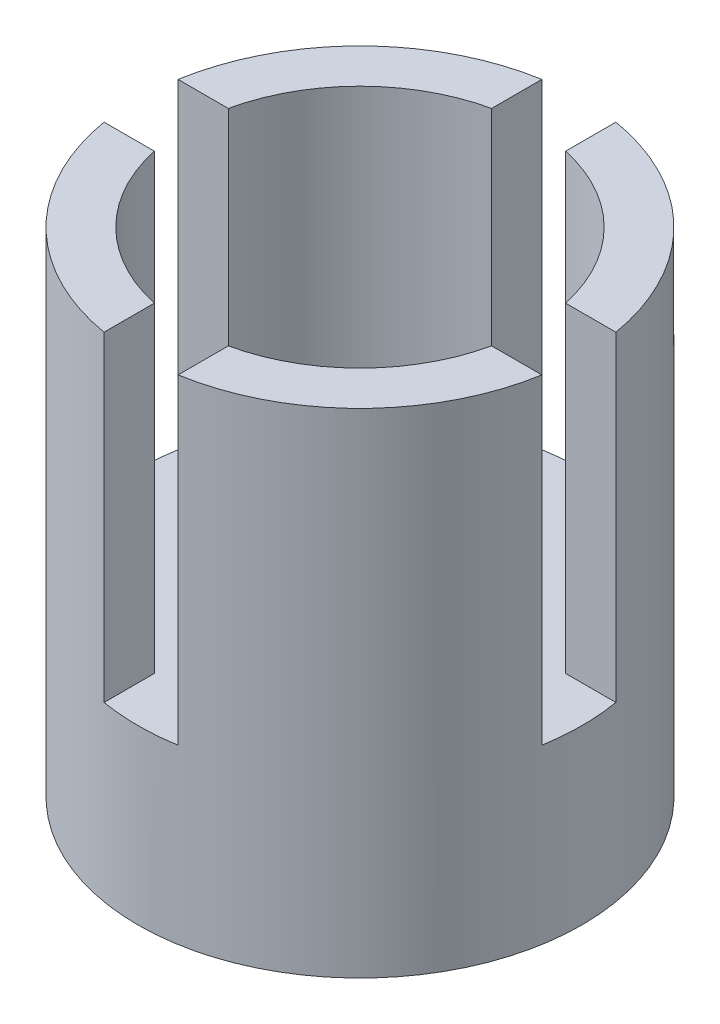
ISO-10303-21;
HEADER;
FILE_DESCRIPTION(('STEP AP214'),'2;1');
FILE_NAME('part.step','',(''),(''),'','','');
FILE_SCHEMA(('AUTOMOTIVE_DESIGN { 1 0 10303 214 1 1 1 1 }'));
ENDSEC;
DATA;
#1=APPLICATION_CONTEXT('core data for automotive mechanical design processes');
#2=APPLICATION_PROTOCOL_DEFINITION('international standard','automotive_design',2000,#1);
#3=PRODUCT_CONTEXT('',#1,'mechanical');
#4=PRODUCT('Part','Part','',(#3));
#5=PRODUCT_RELATED_PRODUCT_CATEGORY('part','',(#4));
#6=PRODUCT_DEFINITION_FORMATION('','',#4);
#7=PRODUCT_DEFINITION_CONTEXT('part definition',#1,'design');
#8=PRODUCT_DEFINITION('design','',#6,#7);
#9=PRODUCT_DEFINITION_SHAPE('','',#8);
#10=(LENGTH_UNIT() NAMED_UNIT(*) SI_UNIT(.MILLI.,.METRE.));
#11=(NAMED_UNIT(*) PLANE_ANGLE_UNIT() SI_UNIT($,.RADIAN.));
#12=(NAMED_UNIT(*) SI_UNIT($,.STERADIAN.) SOLID_ANGLE_UNIT());
#13=UNCERTAINTY_MEASURE_WITH_UNIT(LENGTH_MEASURE(1.E-05),#10,'distance_accuracy_value','');
#14=(GEOMETRIC_REPRESENTATION_CONTEXT(3) GLOBAL_UNCERTAINTY_ASSIGNED_CONTEXT((#13)) GLOBAL_UNIT_ASSIGNED_CONTEXT((#10,
#11,#12)) REPRESENTATION_CONTEXT('',''));
#15=CARTESIAN_POINT('',(0.,0.,0.));
#16=DIRECTION('',(0.,0.,1.));
#17=DIRECTION('',(1.,0.,0.));
#18=AXIS2_PLACEMENT_3D('',#15,#16,#17);
#19=CARTESIAN_POINT('',(0.,20.,0.));
#20=DIRECTION('',(0.,1.,0.));
#21=DIRECTION('',(0.,0.,1.));
#22=AXIS2_PLACEMENT_3D('',#19,#20,#21);
#23=PLANE('',#22);
#24=DIRECTION('',(-1.,0.,0.));
#25=VECTOR('',#24,1.);
#26=CARTESIAN_POINT('',(-9.14285714285731,20.,-1.5));
#27=LINE('',#26,#25);
#28=CARTESIAN_POINT('',(-6.83739716558867,20.,-1.5));
#29=VERTEX_POINT('',#28);
#30=CARTESIAN_POINT('',(-8.87411967464942,20.,-1.5));
#31=VERTEX_POINT('',#30);
#32=EDGE_CURVE('E268',#29,#31,#27,.T.);
#33=ORIENTED_EDGE('',*,*,#32,.F.);
#34=CARTESIAN_POINT('',(0.,20.,0.));
#35=DIRECTION('',(0.,1.,0.));
#36=DIRECTION('',(0.,0.,1.));
#37=AXIS2_PLACEMENT_3D('',#34,#35,#36);
#38=CIRCLE('',#37,7.);
#39=CARTESIAN_POINT('',(-1.5,20.,-6.83739716558867));
#40=VERTEX_POINT('',#39);
#41=EDGE_CURVE('E186',#40,#29,#38,.T.);
#42=ORIENTED_EDGE('',*,*,#41,.F.);
#43=DIRECTION('',(0.,0.,1.));
#44=VECTOR('',#43,1.);
#45=CARTESIAN_POINT('',(-1.5,20.,10.8462108796402));
#46=LINE('',#45,#44);
#47=CARTESIAN_POINT('',(-1.5,20.,-8.87411967464942));
#48=VERTEX_POINT('',#47);
#49=EDGE_CURVE('E292',#48,#40,#46,.T.);
#50=ORIENTED_EDGE('',*,*,#49,.F.);
#51=CARTESIAN_POINT('',(0.,20.,0.));
#52=DIRECTION('',(0.,1.,0.));
#53=DIRECTION('',(0.,0.,1.));
#54=AXIS2_PLACEMENT_3D('',#51,#52,#53);
#55=CIRCLE('',#54,9.);
#56=EDGE_CURVE('E239',#48,#31,#55,.T.);
#57=ORIENTED_EDGE('',*,*,#56,.T.);
#58=EDGE_LOOP('',(#33,#42,#50,#57));
#59=FACE_BOUND('',#58,.T.);
#60=ADVANCED_FACE('F36',(#59),#23,.T.);
#61=CARTESIAN_POINT('',(0.,7.,0.));
#62=DIRECTION('',(0.,1.,0.));
#63=DIRECTION('',(0.,0.,1.));
#64=AXIS2_PLACEMENT_3D('',#61,#62,#63);
#65=CYLINDRICAL_SURFACE('',#64,7.);
#66=ORIENTED_EDGE('',*,*,#41,.T.);
#67=DIRECTION('',(0.,1.,0.));
#68=VECTOR('',#67,1.);
#69=CARTESIAN_POINT('',(-6.83739716558867,7.,-1.5));
#70=LINE('',#69,#68);
#71=CARTESIAN_POINT('',(-6.83739716558867,7.,-1.5));
#72=VERTEX_POINT('',#71);
#73=EDGE_CURVE('E172',#29,#72,#70,.F.);
#74=ORIENTED_EDGE('',*,*,#73,.T.);
#75=CARTESIAN_POINT('',(0.,7.,0.));
#76=DIRECTION('',(0.,1.,0.));
#77=DIRECTION('',(0.,0.,1.));
#78=AXIS2_PLACEMENT_3D('',#75,#76,#77);
#79=CIRCLE('',#78,7.);
#80=CARTESIAN_POINT('',(-1.5,7.,-6.83739716558867));
#81=VERTEX_POINT('',#80);
#82=EDGE_CURVE('E184',#81,#72,#79,.T.);
#83=ORIENTED_EDGE('',*,*,#82,.F.);
#84=DIRECTION('',(0.,1.,0.));
#85=VECTOR('',#84,1.);
#86=CARTESIAN_POINT('',(-1.5,7.,-6.83739716558867));
#87=LINE('',#86,#85);
#88=EDGE_CURVE('E247',#81,#40,#87,.T.);
#89=ORIENTED_EDGE('',*,*,#88,.T.);
#90=EDGE_LOOP('',(#66,#74,#83,#89));
#91=FACE_BOUND('',#90,.T.);
#92=ADVANCED_FACE('F182',(#91),#65,.F.);
#93=CARTESIAN_POINT('',(8.87411967464942,20.,-1.5));
#94=VERTEX_POINT('',#93);
#95=CARTESIAN_POINT('',(6.83739716558867,20.,-1.5));
#96=VERTEX_POINT('',#95);
#97=EDGE_CURVE('E271',#94,#96,#27,.T.);
#98=ORIENTED_EDGE('',*,*,#97,.F.);
#99=CARTESIAN_POINT('',(1.5,20.,-8.87411967464942));
#100=VERTEX_POINT('',#99);
#101=EDGE_CURVE('E237',#94,#100,#55,.T.);
#102=ORIENTED_EDGE('',*,*,#101,.T.);
#103=DIRECTION('',(0.,0.,-1.));
#104=VECTOR('',#103,1.);
#105=CARTESIAN_POINT('',(1.5,20.,10.8462108796402));
#106=LINE('',#105,#104);
#107=CARTESIAN_POINT('',(1.5,20.,-6.83739716558867));
#108=VERTEX_POINT('',#107);
#109=EDGE_CURVE('E187',#108,#100,#106,.T.);
#110=ORIENTED_EDGE('',*,*,#109,.F.);
#111=EDGE_CURVE('E319',#96,#108,#38,.T.);
#112=ORIENTED_EDGE('',*,*,#111,.F.);
#113=EDGE_LOOP('',(#98,#102,#110,#112));
#114=FACE_BOUND('',#113,.T.);
#115=ADVANCED_FACE('F335',(#114),#23,.T.);
#116=CARTESIAN_POINT('',(6.83739716558867,7.,-1.5));
#117=VERTEX_POINT('',#116);
#118=CARTESIAN_POINT('',(1.5,7.,-6.83739716558867));
#119=VERTEX_POINT('',#118);
#120=EDGE_CURVE('E194',#117,#119,#79,.T.);
#121=ORIENTED_EDGE('',*,*,#120,.F.);
#122=DIRECTION('',(0.,1.,0.));
#123=VECTOR('',#122,1.);
#124=CARTESIAN_POINT('',(6.83739716558867,7.,-1.5));
#125=LINE('',#124,#123);
#126=EDGE_CURVE('E11',#117,#96,#125,.T.);
#127=ORIENTED_EDGE('',*,*,#126,.T.);
#128=ORIENTED_EDGE('',*,*,#111,.T.);
#129=DIRECTION('',(0.,1.,0.));
#130=VECTOR('',#129,1.);
#131=CARTESIAN_POINT('',(1.5,7.,-6.83739716558867));
#132=LINE('',#131,#130);
#133=EDGE_CURVE('E244',#108,#119,#132,.F.);
#134=ORIENTED_EDGE('',*,*,#133,.T.);
#135=EDGE_LOOP('',(#121,#127,#128,#134));
#136=FACE_BOUND('',#135,.T.);
#137=ADVANCED_FACE('F328',(#136),#65,.F.);
#138=DIRECTION('',(1.,0.,0.));
#139=VECTOR('',#138,1.);
#140=CARTESIAN_POINT('',(-9.14285714285731,20.,1.5));
#141=LINE('',#140,#139);
#142=CARTESIAN_POINT('',(-8.87411967464942,20.,1.5));
#143=VERTEX_POINT('',#142);
#144=CARTESIAN_POINT('',(-6.83739716558867,20.,1.5));
#145=VERTEX_POINT('',#144);
#146=EDGE_CURVE('E266',#143,#145,#141,.T.);
#147=ORIENTED_EDGE('',*,*,#146,.F.);
#148=CARTESIAN_POINT('',(-1.5,20.,8.87411967464942));
#149=VERTEX_POINT('',#148);
#150=EDGE_CURVE('E238',#143,#149,#55,.T.);
#151=ORIENTED_EDGE('',*,*,#150,.T.);
#152=CARTESIAN_POINT('',(-1.5,20.,6.83739716558867));
#153=VERTEX_POINT('',#152);
#154=EDGE_CURVE('E299',#153,#149,#46,.T.);
#155=ORIENTED_EDGE('',*,*,#154,.F.);
#156=EDGE_CURVE('E315',#145,#153,#38,.T.);
#157=ORIENTED_EDGE('',*,*,#156,.F.);
#158=EDGE_LOOP('',(#147,#151,#155,#157));
#159=FACE_BOUND('',#158,.T.);
#160=ADVANCED_FACE('F342',(#159),#23,.T.);
#161=CARTESIAN_POINT('',(-6.83739716558867,7.,1.5));
#162=VERTEX_POINT('',#161);
#163=CARTESIAN_POINT('',(-1.5,7.,6.83739716558867));
#164=VERTEX_POINT('',#163);
#165=EDGE_CURVE('E195',#162,#164,#79,.T.);
#166=ORIENTED_EDGE('',*,*,#165,.F.);
#167=DIRECTION('',(0.,1.,0.));
#168=VECTOR('',#167,1.);
#169=CARTESIAN_POINT('',(-6.83739716558867,7.,1.5));
#170=LINE('',#169,#168);
#171=EDGE_CURVE('E282',#162,#145,#170,.T.);
#172=ORIENTED_EDGE('',*,*,#171,.T.);
#173=ORIENTED_EDGE('',*,*,#156,.T.);
#174=DIRECTION('',(0.,1.,0.));
#175=VECTOR('',#174,1.);
#176=CARTESIAN_POINT('',(-1.5,7.,6.83739716558867));
#177=LINE('',#176,#175);
#178=EDGE_CURVE('E249',#153,#164,#177,.F.);
#179=ORIENTED_EDGE('',*,*,#178,.T.);
#180=EDGE_LOOP('',(#166,#172,#173,#179));
#181=FACE_BOUND('',#180,.T.);
#182=ADVANCED_FACE('F363',(#181),#65,.F.);
#183=CARTESIAN_POINT('',(0.,20.,0.));
#184=DIRECTION('',(0.,-1.,0.));
#185=DIRECTION('',(0.,0.,-1.));
#186=AXIS2_PLACEMENT_3D('',#183,#184,#185);
#187=CYLINDRICAL_SURFACE('',#186,9.);
#188=ORIENTED_EDGE('',*,*,#101,.F.);
#189=DIRECTION('',(0.,-1.,0.));
#190=VECTOR('',#189,1.);
#191=CARTESIAN_POINT('',(8.87411967464942,20.,-1.5));
#192=LINE('',#191,#190);
#193=CARTESIAN_POINT('',(8.87411967464942,7.,-1.5));
#194=VERTEX_POINT('',#193);
#195=EDGE_CURVE('E188',#94,#194,#192,.T.);
#196=ORIENTED_EDGE('',*,*,#195,.T.);
#197=CARTESIAN_POINT('',(0.,7.,0.));
#198=DIRECTION('',(0.,1.,0.));
#199=DIRECTION('',(0.,0.,1.));
#200=AXIS2_PLACEMENT_3D('',#197,#198,#199);
#201=CIRCLE('',#200,9.);
#202=CARTESIAN_POINT('',(8.87411967464942,7.,1.5));
#203=VERTEX_POINT('',#202);
#204=EDGE_CURVE('E276',#203,#194,#201,.T.);
#205=ORIENTED_EDGE('',*,*,#204,.F.);
#206=DIRECTION('',(0.,-1.,0.));
#207=VECTOR('',#206,1.);
#208=CARTESIAN_POINT('',(8.87411967464942,20.,1.5));
#209=LINE('',#208,#207);
#210=CARTESIAN_POINT('',(8.87411967464942,20.,1.5));
#211=VERTEX_POINT('',#210);
#212=EDGE_CURVE('E277',#203,#211,#209,.F.);
#213=ORIENTED_EDGE('',*,*,#212,.T.);
#214=CARTESIAN_POINT('',(1.5,20.,8.87411967464942));
#215=VERTEX_POINT('',#214);
#216=EDGE_CURVE('E233',#215,#211,#55,.T.);
#217=ORIENTED_EDGE('',*,*,#216,.F.);
#218=DIRECTION('',(0.,-1.,0.));
#219=VECTOR('',#218,1.);
#220=CARTESIAN_POINT('',(1.5,20.,8.87411967464942));
#221=LINE('',#220,#219);
#222=CARTESIAN_POINT('',(1.5,7.,8.87411967464942));
#223=VERTEX_POINT('',#222);
#224=EDGE_CURVE('E308',#215,#223,#221,.T.);
#225=ORIENTED_EDGE('',*,*,#224,.T.);
#226=CARTESIAN_POINT('',(0.,7.,0.));
#227=DIRECTION('',(0.,1.,0.));
#228=DIRECTION('',(0.,0.,1.));
#229=AXIS2_PLACEMENT_3D('',#226,#227,#228);
#230=CIRCLE('',#229,9.);
#231=CARTESIAN_POINT('',(-1.5,7.,8.87411967464942));
#232=VERTEX_POINT('',#231);
#233=EDGE_CURVE('E302',#232,#223,#230,.T.);
#234=ORIENTED_EDGE('',*,*,#233,.F.);
#235=DIRECTION('',(0.,-1.,0.));
#236=VECTOR('',#235,1.);
#237=CARTESIAN_POINT('',(-1.5,20.,8.87411967464942));
#238=LINE('',#237,#236);
#239=EDGE_CURVE('E311',#232,#149,#238,.F.);
#240=ORIENTED_EDGE('',*,*,#239,.T.);
#241=ORIENTED_EDGE('',*,*,#150,.F.);
#242=DIRECTION('',(0.,-1.,0.));
#243=VECTOR('',#242,1.);
#244=CARTESIAN_POINT('',(-8.87411967464942,20.,1.5));
#245=LINE('',#244,#243);
#246=CARTESIAN_POINT('',(-8.87411967464942,7.,1.5));
#247=VERTEX_POINT('',#246);
#248=EDGE_CURVE('E279',#143,#247,#245,.T.);
#249=ORIENTED_EDGE('',*,*,#248,.T.);
#250=CARTESIAN_POINT('',(-8.87411967464942,7.,-1.5));
#251=VERTEX_POINT('',#250);
#252=EDGE_CURVE('E274',#251,#247,#201,.T.);
#253=ORIENTED_EDGE('',*,*,#252,.F.);
#254=DIRECTION('',(0.,-1.,0.));
#255=VECTOR('',#254,1.);
#256=CARTESIAN_POINT('',(-8.87411967464942,20.,-1.5));
#257=LINE('',#256,#255);
#258=EDGE_CURVE('E175',#251,#31,#257,.F.);
#259=ORIENTED_EDGE('',*,*,#258,.T.);
#260=ORIENTED_EDGE('',*,*,#56,.F.);
#261=DIRECTION('',(0.,-1.,0.));
#262=VECTOR('',#261,1.);
#263=CARTESIAN_POINT('',(-1.5,20.,-8.87411967464942));
#264=LINE('',#263,#262);
#265=CARTESIAN_POINT('',(-1.5,7.,-8.87411967464942));
#266=VERTEX_POINT('',#265);
#267=EDGE_CURVE('E313',#48,#266,#264,.T.);
#268=ORIENTED_EDGE('',*,*,#267,.T.);
#269=CARTESIAN_POINT('',(1.5,7.,-8.87411967464942));
#270=VERTEX_POINT('',#269);
#271=EDGE_CURVE('E304',#270,#266,#230,.T.);
#272=ORIENTED_EDGE('',*,*,#271,.F.);
#273=DIRECTION('',(0.,-1.,0.));
#274=VECTOR('',#273,1.);
#275=CARTESIAN_POINT('',(1.5,20.,-8.87411967464942));
#276=LINE('',#275,#274);
#277=EDGE_CURVE('E305',#270,#100,#276,.F.);
#278=ORIENTED_EDGE('',*,*,#277,.T.);
#279=EDGE_LOOP('',(#188,#196,#205,#213,#217,#225,#234,#240,#241,#249,#253,#259,#260,#268,#272,#278));
#280=FACE_BOUND('',#279,.T.);
#281=CARTESIAN_POINT('',(0.,0.,0.));
#282=DIRECTION('',(0.,1.,0.));
#283=DIRECTION('',(0.,0.,1.));
#284=AXIS2_PLACEMENT_3D('',#281,#282,#283);
#285=CIRCLE('',#284,9.);
#286=CARTESIAN_POINT('',(0.,0.,9.));
#287=VERTEX_POINT('',#286);
#288=EDGE_CURVE('E226',#287,#287,#285,.T.);
#289=ORIENTED_EDGE('',*,*,#288,.T.);
#290=EDGE_LOOP('',(#289));
#291=FACE_BOUND('',#290,.T.);
#292=ADVANCED_FACE('F38',(#280,#291),#187,.T.);
#293=CARTESIAN_POINT('',(6.83739716558867,20.,1.5));
#294=VERTEX_POINT('',#293);
#295=EDGE_CURVE('E259',#294,#211,#141,.T.);
#296=ORIENTED_EDGE('',*,*,#295,.F.);
#297=CARTESIAN_POINT('',(1.5,20.,6.83739716558867));
#298=VERTEX_POINT('',#297);
#299=EDGE_CURVE('E198',#298,#294,#38,.T.);
#300=ORIENTED_EDGE('',*,*,#299,.F.);
#301=EDGE_CURVE('E298',#215,#298,#106,.T.);
#302=ORIENTED_EDGE('',*,*,#301,.F.);
#303=ORIENTED_EDGE('',*,*,#216,.T.);
#304=EDGE_LOOP('',(#296,#300,#302,#303));
#305=FACE_BOUND('',#304,.T.);
#306=ADVANCED_FACE('F263',(#305),#23,.T.);
#307=CARTESIAN_POINT('',(0.,0.,0.));
#308=DIRECTION('',(0.,1.,0.));
#309=DIRECTION('',(0.,0.,1.));
#310=AXIS2_PLACEMENT_3D('',#307,#308,#309);
#311=PLANE('',#310);
#312=DIRECTION('',(1.,0.,0.));
#313=VECTOR('',#312,1.);
#314=CARTESIAN_POINT('',(-2.12132034355964,0.,-1.75));
#315=LINE('',#314,#313);
#316=CARTESIAN_POINT('',(-2.12132034355964,0.,-1.75));
#317=VERTEX_POINT('',#316);
#318=CARTESIAN_POINT('',(2.12132034355964,0.,-1.75));
#319=VERTEX_POINT('',#318);
#320=EDGE_CURVE('E205',#317,#319,#315,.T.);
#321=ORIENTED_EDGE('',*,*,#320,.F.);
#322=CARTESIAN_POINT('',(0.,0.,0.));
#323=DIRECTION('',(0.,-1.,0.));
#324=DIRECTION('',(0.,0.,-1.));
#325=AXIS2_PLACEMENT_3D('',#322,#323,#324);
#326=CIRCLE('',#325,2.75);
#327=CARTESIAN_POINT('',(-2.12132034355964,0.,1.75));
#328=VERTEX_POINT('',#327);
#329=EDGE_CURVE('E202',#328,#317,#326,.T.);
#330=ORIENTED_EDGE('',*,*,#329,.F.);
#331=DIRECTION('',(-1.,0.,0.));
#332=VECTOR('',#331,1.);
#333=CARTESIAN_POINT('',(-2.12132034355964,0.,1.75));
#334=LINE('',#333,#332);
#335=CARTESIAN_POINT('',(2.12132034355964,0.,1.75));
#336=VERTEX_POINT('',#335);
#337=EDGE_CURVE('E220',#336,#328,#334,.T.);
#338=ORIENTED_EDGE('',*,*,#337,.F.);
#339=CARTESIAN_POINT('',(0.,0.,0.));
#340=DIRECTION('',(0.,-1.,0.));
#341=DIRECTION('',(0.,0.,-1.));
#342=AXIS2_PLACEMENT_3D('',#339,#340,#341);
#343=CIRCLE('',#342,2.75);
#344=EDGE_CURVE('E212',#319,#336,#343,.T.);
#345=ORIENTED_EDGE('',*,*,#344,.F.);
#346=EDGE_LOOP('',(#321,#330,#338,#345));
#347=FACE_BOUND('',#346,.T.);
#348=ORIENTED_EDGE('',*,*,#288,.F.);
#349=EDGE_LOOP('',(#348));
#350=FACE_BOUND('',#349,.T.);
#351=ADVANCED_FACE('F382',(#347,#350),#311,.F.);
#352=CARTESIAN_POINT('',(0.,7.,0.));
#353=DIRECTION('',(0.,-1.,0.));
#354=DIRECTION('',(0.,0.,-1.));
#355=AXIS2_PLACEMENT_3D('',#352,#353,#354);
#356=CYLINDRICAL_SURFACE('',#355,2.75);
#357=ORIENTED_EDGE('',*,*,#329,.T.);
#358=DIRECTION('',(0.,-1.,0.));
#359=VECTOR('',#358,1.);
#360=CARTESIAN_POINT('',(-2.12132034355964,7.,-1.75));
#361=LINE('',#360,#359);
#362=CARTESIAN_POINT('',(-2.12132034355964,7.,-1.75));
#363=VERTEX_POINT('',#362);
#364=EDGE_CURVE('E231',#363,#317,#361,.T.);
#365=ORIENTED_EDGE('',*,*,#364,.F.);
#366=CARTESIAN_POINT('',(0.,7.,0.));
#367=DIRECTION('',(0.,-1.,0.));
#368=DIRECTION('',(0.,0.,-1.));
#369=AXIS2_PLACEMENT_3D('',#366,#367,#368);
#370=CIRCLE('',#369,2.75);
#371=CARTESIAN_POINT('',(-2.12132034355964,7.,1.75));
#372=VERTEX_POINT('',#371);
#373=EDGE_CURVE('E223',#372,#363,#370,.T.);
#374=ORIENTED_EDGE('',*,*,#373,.F.);
#375=DIRECTION('',(0.,-1.,0.));
#376=VECTOR('',#375,1.);
#377=CARTESIAN_POINT('',(-2.12132034355964,7.,1.75));
#378=LINE('',#377,#376);
#379=EDGE_CURVE('E224',#372,#328,#378,.T.);
#380=ORIENTED_EDGE('',*,*,#379,.T.);
#381=EDGE_LOOP('',(#357,#365,#374,#380));
#382=FACE_BOUND('',#381,.T.);
#383=ADVANCED_FACE('F386',(#382),#356,.F.);
#384=CARTESIAN_POINT('',(-2.12132034355964,7.,1.75));
#385=DIRECTION('',(0.,0.,1.));
#386=DIRECTION('',(1.,0.,0.));
#387=AXIS2_PLACEMENT_3D('',#384,#385,#386);
#388=PLANE('',#387);
#389=ORIENTED_EDGE('',*,*,#337,.T.);
#390=ORIENTED_EDGE('',*,*,#379,.F.);
#391=DIRECTION('',(-1.,0.,0.));
#392=VECTOR('',#391,1.);
#393=CARTESIAN_POINT('',(-2.12132034355964,7.,1.75));
#394=LINE('',#393,#392);
#395=CARTESIAN_POINT('',(2.12132034355964,7.,1.75));
#396=VERTEX_POINT('',#395);
#397=EDGE_CURVE('E215',#396,#372,#394,.T.);
#398=ORIENTED_EDGE('',*,*,#397,.F.);
#399=DIRECTION('',(0.,-1.,0.));
#400=VECTOR('',#399,1.);
#401=CARTESIAN_POINT('',(2.12132034355964,7.,1.75));
#402=LINE('',#401,#400);
#403=EDGE_CURVE('E227',#396,#336,#402,.T.);
#404=ORIENTED_EDGE('',*,*,#403,.T.);
#405=EDGE_LOOP('',(#389,#390,#398,#404));
#406=FACE_BOUND('',#405,.T.);
#407=ADVANCED_FACE('F391',(#406),#388,.F.);
#408=CARTESIAN_POINT('',(0.,7.,0.));
#409=DIRECTION('',(0.,-1.,0.));
#410=DIRECTION('',(0.,0.,-1.));
#411=AXIS2_PLACEMENT_3D('',#408,#409,#410);
#412=CYLINDRICAL_SURFACE('',#411,2.75);
#413=ORIENTED_EDGE('',*,*,#344,.T.);
#414=ORIENTED_EDGE('',*,*,#403,.F.);
#415=CARTESIAN_POINT('',(0.,7.,0.));
#416=DIRECTION('',(0.,-1.,0.));
#417=DIRECTION('',(0.,0.,-1.));
#418=AXIS2_PLACEMENT_3D('',#415,#416,#417);
#419=CIRCLE('',#418,2.75);
#420=CARTESIAN_POINT('',(2.12132034355964,7.,-1.75));
#421=VERTEX_POINT('',#420);
#422=EDGE_CURVE('E406',#421,#396,#419,.T.);
#423=ORIENTED_EDGE('',*,*,#422,.F.);
#424=DIRECTION('',(0.,-1.,0.));
#425=VECTOR('',#424,1.);
#426=CARTESIAN_POINT('',(2.12132034355964,7.,-1.75));
#427=LINE('',#426,#425);
#428=EDGE_CURVE('E229',#421,#319,#427,.T.);
#429=ORIENTED_EDGE('',*,*,#428,.T.);
#430=EDGE_LOOP('',(#413,#414,#423,#429));
#431=FACE_BOUND('',#430,.T.);
#432=ADVANCED_FACE('F412',(#431),#412,.F.);
#433=CARTESIAN_POINT('',(-2.12132034355964,7.,-1.75));
#434=DIRECTION('',(0.,0.,-1.));
#435=DIRECTION('',(-1.,0.,0.));
#436=AXIS2_PLACEMENT_3D('',#433,#434,#435);
#437=PLANE('',#436);
#438=ORIENTED_EDGE('',*,*,#320,.T.);
#439=ORIENTED_EDGE('',*,*,#428,.F.);
#440=DIRECTION('',(1.,0.,0.));
#441=VECTOR('',#440,1.);
#442=CARTESIAN_POINT('',(-2.12132034355964,7.,-1.75));
#443=LINE('',#442,#441);
#444=EDGE_CURVE('E402',#363,#421,#443,.T.);
#445=ORIENTED_EDGE('',*,*,#444,.F.);
#446=ORIENTED_EDGE('',*,*,#364,.T.);
#447=EDGE_LOOP('',(#438,#439,#445,#446));
#448=FACE_BOUND('',#447,.T.);
#449=ADVANCED_FACE('F399',(#448),#437,.F.);
#450=CARTESIAN_POINT('',(0.,7.,0.));
#451=DIRECTION('',(0.,1.,0.));
#452=DIRECTION('',(0.,0.,1.));
#453=AXIS2_PLACEMENT_3D('',#450,#451,#452);
#454=PLANE('',#453);
#455=ORIENTED_EDGE('',*,*,#422,.T.);
#456=ORIENTED_EDGE('',*,*,#397,.T.);
#457=ORIENTED_EDGE('',*,*,#373,.T.);
#458=ORIENTED_EDGE('',*,*,#444,.T.);
#459=EDGE_LOOP('',(#455,#456,#457,#458));
#460=FACE_BOUND('',#459,.T.);
#461=DIRECTION('',(1.,0.,0.));
#462=VECTOR('',#461,1.);
#463=CARTESIAN_POINT('',(-9.14285714285731,7.,-1.5));
#464=LINE('',#463,#462);
#465=EDGE_CURVE('E58',#117,#194,#464,.T.);
#466=ORIENTED_EDGE('',*,*,#465,.F.);
#467=ORIENTED_EDGE('',*,*,#120,.T.);
#468=DIRECTION('',(0.,0.,-1.));
#469=VECTOR('',#468,1.);
#470=CARTESIAN_POINT('',(1.5,7.,10.8462108796402));
#471=LINE('',#470,#469);
#472=EDGE_CURVE('E288',#119,#270,#471,.T.);
#473=ORIENTED_EDGE('',*,*,#472,.T.);
#474=ORIENTED_EDGE('',*,*,#271,.T.);
#475=DIRECTION('',(0.,0.,1.));
#476=VECTOR('',#475,1.);
#477=CARTESIAN_POINT('',(-1.5,7.,10.8462108796402));
#478=LINE('',#477,#476);
#479=EDGE_CURVE('E192',#266,#81,#478,.T.);
#480=ORIENTED_EDGE('',*,*,#479,.T.);
#481=ORIENTED_EDGE('',*,*,#82,.T.);
#482=EDGE_CURVE('E51',#251,#72,#464,.T.);
#483=ORIENTED_EDGE('',*,*,#482,.F.);
#484=ORIENTED_EDGE('',*,*,#252,.T.);
#485=DIRECTION('',(-1.,0.,0.));
#486=VECTOR('',#485,1.);
#487=CARTESIAN_POINT('',(-9.14285714285731,7.,1.5));
#488=LINE('',#487,#486);
#489=EDGE_CURVE('E177',#162,#247,#488,.T.);
#490=ORIENTED_EDGE('',*,*,#489,.F.);
#491=ORIENTED_EDGE('',*,*,#165,.T.);
#492=EDGE_CURVE('E293',#164,#232,#478,.T.);
#493=ORIENTED_EDGE('',*,*,#492,.T.);
#494=ORIENTED_EDGE('',*,*,#233,.T.);
#495=CARTESIAN_POINT('',(1.5,7.,6.83739716558867));
#496=VERTEX_POINT('',#495);
#497=EDGE_CURVE('E291',#223,#496,#471,.T.);
#498=ORIENTED_EDGE('',*,*,#497,.T.);
#499=CARTESIAN_POINT('',(6.83739716558867,7.,1.5));
#500=VERTEX_POINT('',#499);
#501=EDGE_CURVE('E197',#496,#500,#79,.T.);
#502=ORIENTED_EDGE('',*,*,#501,.T.);
#503=EDGE_CURVE('E261',#203,#500,#488,.T.);
#504=ORIENTED_EDGE('',*,*,#503,.F.);
#505=ORIENTED_EDGE('',*,*,#204,.T.);
#506=EDGE_LOOP('',(#466,#467,#473,#474,#480,#481,#483,#484,#490,#491,#493,#494,#498,#502,#504,#505));
#507=FACE_BOUND('',#506,.T.);
#508=ADVANCED_FACE('F190',(#460,#507),#454,.T.);
#509=ORIENTED_EDGE('',*,*,#299,.T.);
#510=DIRECTION('',(0.,1.,0.));
#511=VECTOR('',#510,1.);
#512=CARTESIAN_POINT('',(6.83739716558867,7.,1.5));
#513=LINE('',#512,#511);
#514=EDGE_CURVE('E44',#294,#500,#513,.F.);
#515=ORIENTED_EDGE('',*,*,#514,.T.);
#516=ORIENTED_EDGE('',*,*,#501,.F.);
#517=DIRECTION('',(0.,1.,0.));
#518=VECTOR('',#517,1.);
#519=CARTESIAN_POINT('',(1.5,7.,6.83739716558867));
#520=LINE('',#519,#518);
#521=EDGE_CURVE('E236',#496,#298,#520,.T.);
#522=ORIENTED_EDGE('',*,*,#521,.T.);
#523=EDGE_LOOP('',(#509,#515,#516,#522));
#524=FACE_BOUND('',#523,.T.);
#525=ADVANCED_FACE('F254',(#524),#65,.F.);
#526=CARTESIAN_POINT('',(1.5,7.,10.8462108796402));
#527=DIRECTION('',(1.,0.,0.));
#528=DIRECTION('',(0.,0.,-1.));
#529=AXIS2_PLACEMENT_3D('',#526,#527,#528);
#530=PLANE('',#529);
#531=ORIENTED_EDGE('',*,*,#301,.T.);
#532=ORIENTED_EDGE('',*,*,#521,.F.);
#533=ORIENTED_EDGE('',*,*,#497,.F.);
#534=ORIENTED_EDGE('',*,*,#224,.F.);
#535=EDGE_LOOP('',(#531,#532,#533,#534));
#536=FACE_BOUND('',#535,.T.);
#537=ADVANCED_FACE('F351',(#536),#530,.F.);
#538=CARTESIAN_POINT('',(-1.5,7.,10.8462108796402));
#539=DIRECTION('',(-1.,0.,0.));
#540=DIRECTION('',(0.,0.,1.));
#541=AXIS2_PLACEMENT_3D('',#538,#539,#540);
#542=PLANE('',#541);
#543=ORIENTED_EDGE('',*,*,#492,.F.);
#544=ORIENTED_EDGE('',*,*,#178,.F.);
#545=ORIENTED_EDGE('',*,*,#154,.T.);
#546=ORIENTED_EDGE('',*,*,#239,.F.);
#547=EDGE_LOOP('',(#543,#544,#545,#546));
#548=FACE_BOUND('',#547,.T.);
#549=ADVANCED_FACE('F345',(#548),#542,.F.);
#550=ORIENTED_EDGE('',*,*,#49,.T.);
#551=ORIENTED_EDGE('',*,*,#88,.F.);
#552=ORIENTED_EDGE('',*,*,#479,.F.);
#553=ORIENTED_EDGE('',*,*,#267,.F.);
#554=EDGE_LOOP('',(#550,#551,#552,#553));
#555=FACE_BOUND('',#554,.T.);
#556=ADVANCED_FACE('F356',(#555),#542,.F.);
#557=ORIENTED_EDGE('',*,*,#472,.F.);
#558=ORIENTED_EDGE('',*,*,#133,.F.);
#559=ORIENTED_EDGE('',*,*,#109,.T.);
#560=ORIENTED_EDGE('',*,*,#277,.F.);
#561=EDGE_LOOP('',(#557,#558,#559,#560));
#562=FACE_BOUND('',#561,.T.);
#563=ADVANCED_FACE('F334',(#562),#530,.F.);
#564=CARTESIAN_POINT('',(-9.14285714285731,-14.5245990854793,1.5));
#565=DIRECTION('',(0.,0.,1.));
#566=DIRECTION('',(1.,0.,0.));
#567=AXIS2_PLACEMENT_3D('',#564,#565,#566);
#568=PLANE('',#567);
#569=ORIENTED_EDGE('',*,*,#503,.T.);
#570=ORIENTED_EDGE('',*,*,#514,.F.);
#571=ORIENTED_EDGE('',*,*,#295,.T.);
#572=ORIENTED_EDGE('',*,*,#212,.F.);
#573=EDGE_LOOP('',(#569,#570,#571,#572));
#574=FACE_BOUND('',#573,.T.);
#575=ADVANCED_FACE('F258',(#574),#568,.F.);
#576=CARTESIAN_POINT('',(-9.14285714285731,-14.5245990854793,-1.5));
#577=DIRECTION('',(0.,0.,-1.));
#578=DIRECTION('',(-1.,0.,0.));
#579=AXIS2_PLACEMENT_3D('',#576,#577,#578);
#580=PLANE('',#579);
#581=ORIENTED_EDGE('',*,*,#97,.T.);
#582=ORIENTED_EDGE('',*,*,#126,.F.);
#583=ORIENTED_EDGE('',*,*,#465,.T.);
#584=ORIENTED_EDGE('',*,*,#195,.F.);
#585=EDGE_LOOP('',(#581,#582,#583,#584));
#586=FACE_BOUND('',#585,.T.);
#587=ADVANCED_FACE('F354',(#586),#580,.F.);
#588=ORIENTED_EDGE('',*,*,#32,.T.);
#589=ORIENTED_EDGE('',*,*,#258,.F.);
#590=ORIENTED_EDGE('',*,*,#482,.T.);
#591=ORIENTED_EDGE('',*,*,#73,.F.);
#592=EDGE_LOOP('',(#588,#589,#590,#591));
#593=FACE_BOUND('',#592,.T.);
#594=ADVANCED_FACE('F171',(#593),#580,.F.);
#595=ORIENTED_EDGE('',*,*,#489,.T.);
#596=ORIENTED_EDGE('',*,*,#248,.F.);
#597=ORIENTED_EDGE('',*,*,#146,.T.);
#598=ORIENTED_EDGE('',*,*,#171,.F.);
#599=EDGE_LOOP('',(#595,#596,#597,#598));
#600=FACE_BOUND('',#599,.T.);
#601=ADVANCED_FACE('F362',(#600),#568,.F.);
#602=CLOSED_SHELL('',(#60,#92,#115,#137,#160,#182,#292,#306,#351,#383,#407,#432,#449,#508,#525,
#537,#549,#556,#563,#575,#587,#594,#601));
#603=MANIFOLD_SOLID_BREP('B2',#602);
#604=ADVANCED_BREP_SHAPE_REPRESENTATION('',(#18,#603),#14);
#605=SHAPE_DEFINITION_REPRESENTATION(#9,#604);
ENDSEC;
END-ISO-10303-21;
